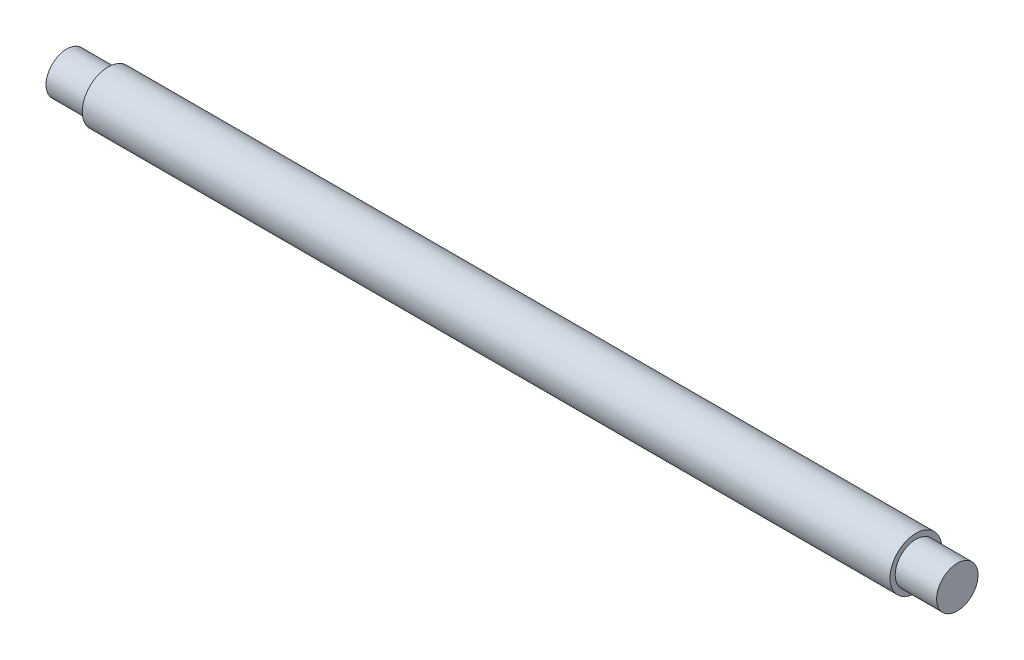
ISO-10303-21;
HEADER;
FILE_DESCRIPTION(('STEP AP214'),'2;1');
FILE_NAME('part.step','',(''),(''),'','','');
FILE_SCHEMA(('AUTOMOTIVE_DESIGN { 1 0 10303 214 1 1 1 1 }'));
ENDSEC;
DATA;
#1=APPLICATION_CONTEXT('core data for automotive mechanical design processes');
#2=APPLICATION_PROTOCOL_DEFINITION('international standard','automotive_design',2000,#1);
#3=PRODUCT_CONTEXT('',#1,'mechanical');
#4=PRODUCT('Part','Part','',(#3));
#5=PRODUCT_RELATED_PRODUCT_CATEGORY('part','',(#4));
#6=PRODUCT_DEFINITION_FORMATION('','',#4);
#7=PRODUCT_DEFINITION_CONTEXT('part definition',#1,'design');
#8=PRODUCT_DEFINITION('design','',#6,#7);
#9=PRODUCT_DEFINITION_SHAPE('','',#8);
#10=(LENGTH_UNIT() NAMED_UNIT(*) SI_UNIT(.MILLI.,.METRE.));
#11=(NAMED_UNIT(*) PLANE_ANGLE_UNIT() SI_UNIT($,.RADIAN.));
#12=(NAMED_UNIT(*) SI_UNIT($,.STERADIAN.) SOLID_ANGLE_UNIT());
#13=UNCERTAINTY_MEASURE_WITH_UNIT(LENGTH_MEASURE(1.E-05),#10,'distance_accuracy_value','');
#14=(GEOMETRIC_REPRESENTATION_CONTEXT(3) GLOBAL_UNCERTAINTY_ASSIGNED_CONTEXT((#13)) GLOBAL_UNIT_ASSIGNED_CONTEXT((#10,
#11,#12)) REPRESENTATION_CONTEXT('',''));
#15=CARTESIAN_POINT('',(0.,0.,0.));
#16=DIRECTION('',(0.,0.,1.));
#17=DIRECTION('',(1.,0.,0.));
#18=AXIS2_PLACEMENT_3D('',#15,#16,#17);
#19=CARTESIAN_POINT('',(0.,0.,0.));
#20=DIRECTION('',(1.,0.,0.));
#21=DIRECTION('',(0.,0.,-1.));
#22=AXIS2_PLACEMENT_3D('',#19,#20,#21);
#23=PLANE('',#22);
#24=CARTESIAN_POINT('',(0.,0.,0.));
#25=DIRECTION('',(-1.,0.,0.));
#26=DIRECTION('',(0.,0.,1.));
#27=AXIS2_PLACEMENT_3D('',#24,#25,#26);
#28=CIRCLE('',#27,4.);
#29=CARTESIAN_POINT('',(0.,0.,4.));
#30=VERTEX_POINT('',#29);
#31=EDGE_CURVE('E10',#30,#30,#28,.T.);
#32=ORIENTED_EDGE('',*,*,#31,.T.);
#33=EDGE_LOOP('',(#32));
#34=FACE_BOUND('',#33,.T.);
#35=ADVANCED_FACE('F31',(#34),#23,.F.);
#36=CARTESIAN_POINT('',(0.,0.,0.));
#37=DIRECTION('',(-1.,0.,0.));
#38=DIRECTION('',(0.,0.,1.));
#39=AXIS2_PLACEMENT_3D('',#36,#37,#38);
#40=CYLINDRICAL_SURFACE('',#39,4.);
#41=ORIENTED_EDGE('',*,*,#31,.F.);
#42=EDGE_LOOP('',(#41));
#43=FACE_BOUND('',#42,.T.);
#44=CARTESIAN_POINT('',(8.,0.,0.));
#45=DIRECTION('',(-1.,0.,0.));
#46=DIRECTION('',(0.,0.,1.));
#47=AXIS2_PLACEMENT_3D('',#44,#45,#46);
#48=CIRCLE('',#47,4.);
#49=CARTESIAN_POINT('',(8.,0.,4.));
#50=VERTEX_POINT('',#49);
#51=EDGE_CURVE('E37',#50,#50,#48,.T.);
#52=ORIENTED_EDGE('',*,*,#51,.T.);
#53=EDGE_LOOP('',(#52));
#54=FACE_BOUND('',#53,.T.);
#55=ADVANCED_FACE('F69',(#43,#54),#40,.T.);
#56=CARTESIAN_POINT('',(8.,4.,0.));
#57=DIRECTION('',(1.,0.,0.));
#58=DIRECTION('',(0.,0.,-1.));
#59=AXIS2_PLACEMENT_3D('',#56,#57,#58);
#60=PLANE('',#59);
#61=ORIENTED_EDGE('',*,*,#51,.F.);
#62=EDGE_LOOP('',(#61));
#63=FACE_BOUND('',#62,.T.);
#64=CARTESIAN_POINT('',(8.,0.,0.));
#65=DIRECTION('',(-1.,0.,0.));
#66=DIRECTION('',(0.,0.,1.));
#67=AXIS2_PLACEMENT_3D('',#64,#65,#66);
#68=CIRCLE('',#67,5.);
#69=CARTESIAN_POINT('',(8.,0.,5.));
#70=VERTEX_POINT('',#69);
#71=EDGE_CURVE('E41',#70,#70,#68,.T.);
#72=ORIENTED_EDGE('',*,*,#71,.T.);
#73=EDGE_LOOP('',(#72));
#74=FACE_BOUND('',#73,.T.);
#75=ADVANCED_FACE('F73',(#63,#74),#60,.F.);
#76=CARTESIAN_POINT('',(0.,0.,0.));
#77=DIRECTION('',(-1.,0.,0.));
#78=DIRECTION('',(0.,0.,1.));
#79=AXIS2_PLACEMENT_3D('',#76,#77,#78);
#80=CYLINDRICAL_SURFACE('',#79,5.);
#81=ORIENTED_EDGE('',*,*,#71,.F.);
#82=EDGE_LOOP('',(#81));
#83=FACE_BOUND('',#82,.T.);
#84=CARTESIAN_POINT('',(164.,0.,0.));
#85=DIRECTION('',(-1.,0.,0.));
#86=DIRECTION('',(0.,0.,1.));
#87=AXIS2_PLACEMENT_3D('',#84,#85,#86);
#88=CIRCLE('',#87,5.);
#89=CARTESIAN_POINT('',(164.,0.,5.));
#90=VERTEX_POINT('',#89);
#91=EDGE_CURVE('E45',#90,#90,#88,.T.);
#92=ORIENTED_EDGE('',*,*,#91,.T.);
#93=EDGE_LOOP('',(#92));
#94=FACE_BOUND('',#93,.T.);
#95=ADVANCED_FACE('F78',(#83,#94),#80,.T.);
#96=CARTESIAN_POINT('',(164.,5.,0.));
#97=DIRECTION('',(-1.,0.,0.));
#98=DIRECTION('',(0.,0.,1.));
#99=AXIS2_PLACEMENT_3D('',#96,#97,#98);
#100=PLANE('',#99);
#101=ORIENTED_EDGE('',*,*,#91,.F.);
#102=EDGE_LOOP('',(#101));
#103=FACE_BOUND('',#102,.T.);
#104=CARTESIAN_POINT('',(164.,0.,0.));
#105=DIRECTION('',(-1.,0.,0.));
#106=DIRECTION('',(0.,0.,1.));
#107=AXIS2_PLACEMENT_3D('',#104,#105,#106);
#108=CIRCLE('',#107,4.);
#109=CARTESIAN_POINT('',(164.,0.,4.));
#110=VERTEX_POINT('',#109);
#111=EDGE_CURVE('E50',#110,#110,#108,.T.);
#112=ORIENTED_EDGE('',*,*,#111,.T.);
#113=EDGE_LOOP('',(#112));
#114=FACE_BOUND('',#113,.T.);
#115=ADVANCED_FACE('F65',(#103,#114),#100,.F.);
#116=CARTESIAN_POINT('',(0.,0.,0.));
#117=DIRECTION('',(-1.,0.,0.));
#118=DIRECTION('',(0.,0.,1.));
#119=AXIS2_PLACEMENT_3D('',#116,#117,#118);
#120=CYLINDRICAL_SURFACE('',#119,4.);
#121=ORIENTED_EDGE('',*,*,#111,.F.);
#122=EDGE_LOOP('',(#121));
#123=FACE_BOUND('',#122,.T.);
#124=CARTESIAN_POINT('',(172.,0.,0.));
#125=DIRECTION('',(-1.,0.,0.));
#126=DIRECTION('',(0.,0.,1.));
#127=AXIS2_PLACEMENT_3D('',#124,#125,#126);
#128=CIRCLE('',#127,4.);
#129=CARTESIAN_POINT('',(172.,0.,4.));
#130=VERTEX_POINT('',#129);
#131=EDGE_CURVE('E53',#130,#130,#128,.T.);
#132=ORIENTED_EDGE('',*,*,#131,.T.);
#133=EDGE_LOOP('',(#132));
#134=FACE_BOUND('',#133,.T.);
#135=ADVANCED_FACE('F57',(#123,#134),#120,.T.);
#136=CARTESIAN_POINT('',(172.,4.,0.));
#137=DIRECTION('',(-1.,0.,0.));
#138=DIRECTION('',(0.,0.,1.));
#139=AXIS2_PLACEMENT_3D('',#136,#137,#138);
#140=PLANE('',#139);
#141=ORIENTED_EDGE('',*,*,#131,.F.);
#142=EDGE_LOOP('',(#141));
#143=FACE_BOUND('',#142,.T.);
#144=ADVANCED_FACE('F59',(#143),#140,.F.);
#145=CLOSED_SHELL('',(#35,#55,#75,#95,#115,#135,#144));
#146=MANIFOLD_SOLID_BREP('B2',#145);
#147=ADVANCED_BREP_SHAPE_REPRESENTATION('',(#18,#146),#14);
#148=SHAPE_DEFINITION_REPRESENTATION(#9,#147);
ENDSEC;
END-ISO-10303-21;
